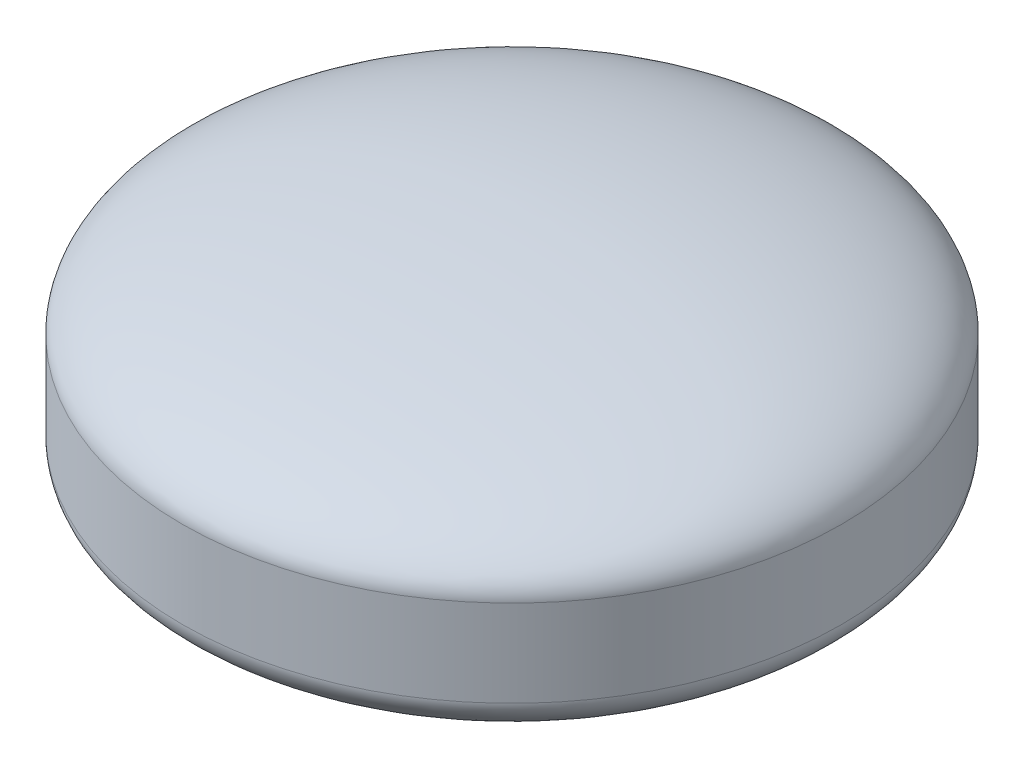
ISO-10303-21;
HEADER;
FILE_DESCRIPTION(('STEP AP214'),'2;1');
FILE_NAME('part.step','',(''),(''),'','','');
FILE_SCHEMA(('AUTOMOTIVE_DESIGN { 1 0 10303 214 1 1 1 1 }'));
ENDSEC;
DATA;
#1=APPLICATION_CONTEXT('core data for automotive mechanical design processes');
#2=APPLICATION_PROTOCOL_DEFINITION('international standard','automotive_design',2000,#1);
#3=PRODUCT_CONTEXT('',#1,'mechanical');
#4=PRODUCT('Part','Part','',(#3));
#5=PRODUCT_RELATED_PRODUCT_CATEGORY('part','',(#4));
#6=PRODUCT_DEFINITION_FORMATION('','',#4);
#7=PRODUCT_DEFINITION_CONTEXT('part definition',#1,'design');
#8=PRODUCT_DEFINITION('design','',#6,#7);
#9=PRODUCT_DEFINITION_SHAPE('','',#8);
#10=(LENGTH_UNIT() NAMED_UNIT(*) SI_UNIT(.MILLI.,.METRE.));
#11=(NAMED_UNIT(*) PLANE_ANGLE_UNIT() SI_UNIT($,.RADIAN.));
#12=(NAMED_UNIT(*) SI_UNIT($,.STERADIAN.) SOLID_ANGLE_UNIT());
#13=UNCERTAINTY_MEASURE_WITH_UNIT(LENGTH_MEASURE(1.E-05),#10,'distance_accuracy_value','');
#14=(GEOMETRIC_REPRESENTATION_CONTEXT(3) GLOBAL_UNCERTAINTY_ASSIGNED_CONTEXT((#13)) GLOBAL_UNIT_ASSIGNED_CONTEXT((#10,
#11,#12)) REPRESENTATION_CONTEXT('',''));
#15=CARTESIAN_POINT('',(0.,0.,0.));
#16=DIRECTION('',(0.,0.,1.));
#17=DIRECTION('',(1.,0.,0.));
#18=AXIS2_PLACEMENT_3D('',#15,#16,#17);
#19=CARTESIAN_POINT('',(0.,1.25,0.));
#20=DIRECTION('',(0.,0.,1.));
#21=DIRECTION('',(-1.,0.,0.));
#22=AXIS2_PLACEMENT_3D('',#19,#20,#21);
#23=ELLIPSE('',#22,9.5,2.5);
#24=TRIMMED_CURVE('',#23,(PARAMETER_VALUE(4.71238898038469)),
(PARAMETER_VALUE(7.85398163397448)),.T.,.PARAMETER.);
#25=CARTESIAN_POINT('',(0.,0.,0.));
#26=DIRECTION('',(0.,-1.,0.));
#27=AXIS1_PLACEMENT('',#25,#26);
#28=SURFACE_OF_REVOLUTION('',#24,#27);
#29=CARTESIAN_POINT('',(0.,1.25,0.));
#30=DIRECTION('',(0.,-1.,0.));
#31=DIRECTION('',(0.,0.,-1.));
#32=AXIS2_PLACEMENT_3D('',#29,#30,#31);
#33=CIRCLE('',#32,9.5);
#34=CARTESIAN_POINT('',(0.,1.25,-9.5));
#35=VERTEX_POINT('',#34);
#36=EDGE_CURVE('E11',#35,#35,#33,.T.);
#37=ORIENTED_EDGE('',*,*,#36,.F.);
#38=EDGE_LOOP('',(#37));
#39=FACE_BOUND('',#38,.T.);
#40=CARTESIAN_POINT('',(0.,3.75,0.));
#41=VERTEX_POINT('',#40);
#42=VERTEX_LOOP('',#41);
#43=FACE_BOUND('',#42,.T.);
#44=ADVANCED_FACE('F36',(#39,#43),#28,.T.);
#45=CARTESIAN_POINT('',(0.,0.,0.));
#46=DIRECTION('',(0.,-1.,0.));
#47=DIRECTION('',(0.,0.,-1.));
#48=AXIS2_PLACEMENT_3D('',#45,#46,#47);
#49=CYLINDRICAL_SURFACE('',#48,9.5);
#50=ORIENTED_EDGE('',*,*,#36,.T.);
#51=EDGE_LOOP('',(#50));
#52=FACE_BOUND('',#51,.T.);
#53=CARTESIAN_POINT('',(0.,-1.25,0.));
#54=DIRECTION('',(0.,-1.,0.));
#55=DIRECTION('',(0.,0.,-1.));
#56=AXIS2_PLACEMENT_3D('',#53,#54,#55);
#57=CIRCLE('',#56,9.5);
#58=CARTESIAN_POINT('',(0.,-1.25,-9.5));
#59=VERTEX_POINT('',#58);
#60=EDGE_CURVE('E43',#59,#59,#57,.T.);
#61=ORIENTED_EDGE('',*,*,#60,.F.);
#62=EDGE_LOOP('',(#61));
#63=FACE_BOUND('',#62,.T.);
#64=ADVANCED_FACE('F51',(#52,#63),#49,.T.);
#65=CARTESIAN_POINT('',(0.,-1.25,0.));
#66=DIRECTION('',(0.,0.,-1.));
#67=DIRECTION('',(-1.,0.,0.));
#68=AXIS2_PLACEMENT_3D('',#65,#66,#67);
#69=ELLIPSE('',#68,9.5,2.5);
#70=TRIMMED_CURVE('',#69,(PARAMETER_VALUE(4.71238898038469)),
(PARAMETER_VALUE(7.85398163397448)),.T.,.PARAMETER.);
#71=CARTESIAN_POINT('',(0.,0.,0.));
#72=DIRECTION('',(0.,1.,0.));
#73=AXIS1_PLACEMENT('',#71,#72);
#74=SURFACE_OF_REVOLUTION('',#70,#73);
#75=ORIENTED_EDGE('',*,*,#60,.T.);
#76=EDGE_LOOP('',(#75));
#77=FACE_BOUND('',#76,.T.);
#78=CARTESIAN_POINT('',(0.,-3.75,0.));
#79=VERTEX_POINT('',#78);
#80=VERTEX_LOOP('',#79);
#81=FACE_BOUND('',#80,.T.);
#82=ADVANCED_FACE('F49',(#77,#81),#74,.T.);
#83=CLOSED_SHELL('',(#44,#64,#82));
#84=MANIFOLD_SOLID_BREP('B2',#83);
#85=ADVANCED_BREP_SHAPE_REPRESENTATION('',(#18,#84),#14);
#86=SHAPE_DEFINITION_REPRESENTATION(#9,#85);
ENDSEC;
END-ISO-10303-21;
